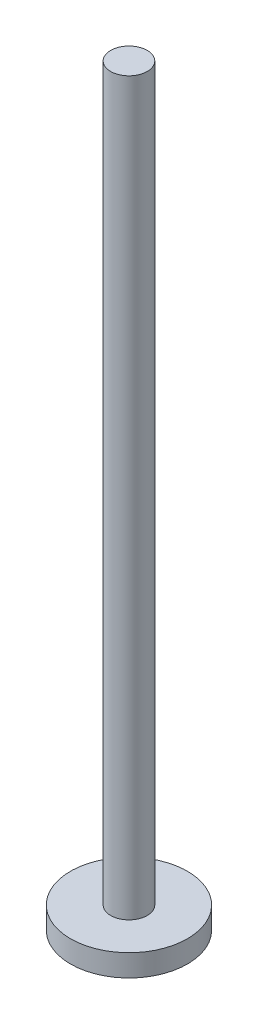
ISO-10303-21;
HEADER;
FILE_DESCRIPTION(('STEP AP214'),'2;1');
FILE_NAME('part.step','',(''),(''),'','','');
FILE_SCHEMA(('AUTOMOTIVE_DESIGN { 1 0 10303 214 1 1 1 1 }'));
ENDSEC;
DATA;
#1=APPLICATION_CONTEXT('core data for automotive mechanical design processes');
#2=APPLICATION_PROTOCOL_DEFINITION('international standard','automotive_design',2000,#1);
#3=PRODUCT_CONTEXT('',#1,'mechanical');
#4=PRODUCT('Part','Part','',(#3));
#5=PRODUCT_RELATED_PRODUCT_CATEGORY('part','',(#4));
#6=PRODUCT_DEFINITION_FORMATION('','',#4);
#7=PRODUCT_DEFINITION_CONTEXT('part definition',#1,'design');
#8=PRODUCT_DEFINITION('design','',#6,#7);
#9=PRODUCT_DEFINITION_SHAPE('','',#8);
#10=(LENGTH_UNIT() NAMED_UNIT(*) SI_UNIT(.MILLI.,.METRE.));
#11=(NAMED_UNIT(*) PLANE_ANGLE_UNIT() SI_UNIT($,.RADIAN.));
#12=(NAMED_UNIT(*) SI_UNIT($,.STERADIAN.) SOLID_ANGLE_UNIT());
#13=UNCERTAINTY_MEASURE_WITH_UNIT(LENGTH_MEASURE(1.E-05),#10,'distance_accuracy_value','');
#14=(GEOMETRIC_REPRESENTATION_CONTEXT(3) GLOBAL_UNCERTAINTY_ASSIGNED_CONTEXT((#13)) GLOBAL_UNIT_ASSIGNED_CONTEXT((#10,
#11,#12)) REPRESENTATION_CONTEXT('',''));
#15=CARTESIAN_POINT('',(0.,0.,0.));
#16=DIRECTION('',(0.,0.,1.));
#17=DIRECTION('',(1.,0.,0.));
#18=AXIS2_PLACEMENT_3D('',#15,#16,#17);
#19=CARTESIAN_POINT('',(0.,3.,0.));
#20=DIRECTION('',(0.,-1.,0.));
#21=DIRECTION('',(0.,0.,-1.));
#22=AXIS2_PLACEMENT_3D('',#19,#20,#21);
#23=CYLINDRICAL_SURFACE('',#22,8.);
#24=CARTESIAN_POINT('',(0.,3.,0.));
#25=DIRECTION('',(0.,1.,0.));
#26=DIRECTION('',(0.,0.,1.));
#27=AXIS2_PLACEMENT_3D('',#24,#25,#26);
#28=CIRCLE('',#27,8.);
#29=CARTESIAN_POINT('',(0.,3.,8.));
#30=VERTEX_POINT('',#29);
#31=EDGE_CURVE('E10',#30,#30,#28,.T.);
#32=ORIENTED_EDGE('',*,*,#31,.F.);
#33=EDGE_LOOP('',(#32));
#34=FACE_BOUND('',#33,.T.);
#35=CARTESIAN_POINT('',(0.,0.,0.));
#36=DIRECTION('',(0.,1.,0.));
#37=DIRECTION('',(0.,0.,1.));
#38=AXIS2_PLACEMENT_3D('',#35,#36,#37);
#39=CIRCLE('',#38,8.);
#40=CARTESIAN_POINT('',(0.,0.,8.));
#41=VERTEX_POINT('',#40);
#42=EDGE_CURVE('E38',#41,#41,#39,.T.);
#43=ORIENTED_EDGE('',*,*,#42,.T.);
#44=EDGE_LOOP('',(#43));
#45=FACE_BOUND('',#44,.T.);
#46=ADVANCED_FACE('F35',(#34,#45),#23,.T.);
#47=CARTESIAN_POINT('',(0.,3.,0.));
#48=DIRECTION('',(0.,1.,0.));
#49=DIRECTION('',(0.,0.,1.));
#50=AXIS2_PLACEMENT_3D('',#47,#48,#49);
#51=PLANE('',#50);
#52=CARTESIAN_POINT('',(0.,3.,0.));
#53=DIRECTION('',(0.,1.,0.));
#54=DIRECTION('',(0.,0.,1.));
#55=AXIS2_PLACEMENT_3D('',#52,#53,#54);
#56=CIRCLE('',#55,2.5);
#57=CARTESIAN_POINT('',(0.,3.,2.5));
#58=VERTEX_POINT('',#57);
#59=EDGE_CURVE('E47',#58,#58,#56,.T.);
#60=ORIENTED_EDGE('',*,*,#59,.F.);
#61=EDGE_LOOP('',(#60));
#62=FACE_BOUND('',#61,.T.);
#63=ORIENTED_EDGE('',*,*,#31,.T.);
#64=EDGE_LOOP('',(#63));
#65=FACE_BOUND('',#64,.T.);
#66=ADVANCED_FACE('F62',(#62,#65),#51,.T.);
#67=CARTESIAN_POINT('',(0.,0.,0.));
#68=DIRECTION('',(0.,1.,0.));
#69=DIRECTION('',(0.,0.,1.));
#70=AXIS2_PLACEMENT_3D('',#67,#68,#69);
#71=PLANE('',#70);
#72=ORIENTED_EDGE('',*,*,#42,.F.);
#73=EDGE_LOOP('',(#72));
#74=FACE_BOUND('',#73,.T.);
#75=ADVANCED_FACE('F58',(#74),#71,.F.);
#76=CARTESIAN_POINT('',(0.,103.,0.));
#77=DIRECTION('',(0.,-1.,0.));
#78=DIRECTION('',(0.,0.,-1.));
#79=AXIS2_PLACEMENT_3D('',#76,#77,#78);
#80=CYLINDRICAL_SURFACE('',#79,2.5);
#81=CARTESIAN_POINT('',(0.,103.,0.));
#82=DIRECTION('',(0.,1.,0.));
#83=DIRECTION('',(0.,0.,1.));
#84=AXIS2_PLACEMENT_3D('',#81,#82,#83);
#85=CIRCLE('',#84,2.5);
#86=CARTESIAN_POINT('',(0.,103.,2.5));
#87=VERTEX_POINT('',#86);
#88=EDGE_CURVE('E45',#87,#87,#85,.T.);
#89=ORIENTED_EDGE('',*,*,#88,.F.);
#90=EDGE_LOOP('',(#89));
#91=FACE_BOUND('',#90,.T.);
#92=ORIENTED_EDGE('',*,*,#59,.T.);
#93=EDGE_LOOP('',(#92));
#94=FACE_BOUND('',#93,.T.);
#95=ADVANCED_FACE('F55',(#91,#94),#80,.T.);
#96=CARTESIAN_POINT('',(0.,103.,0.));
#97=DIRECTION('',(0.,1.,0.));
#98=DIRECTION('',(0.,0.,1.));
#99=AXIS2_PLACEMENT_3D('',#96,#97,#98);
#100=PLANE('',#99);
#101=ORIENTED_EDGE('',*,*,#88,.T.);
#102=EDGE_LOOP('',(#101));
#103=FACE_BOUND('',#102,.T.);
#104=ADVANCED_FACE('F53',(#103),#100,.T.);
#105=CLOSED_SHELL('',(#46,#66,#75,#95,#104));
#106=MANIFOLD_SOLID_BREP('B2',#105);
#107=ADVANCED_BREP_SHAPE_REPRESENTATION('',(#18,#106),#14);
#108=SHAPE_DEFINITION_REPRESENTATION(#9,#107);
ENDSEC;
END-ISO-10303-21;
